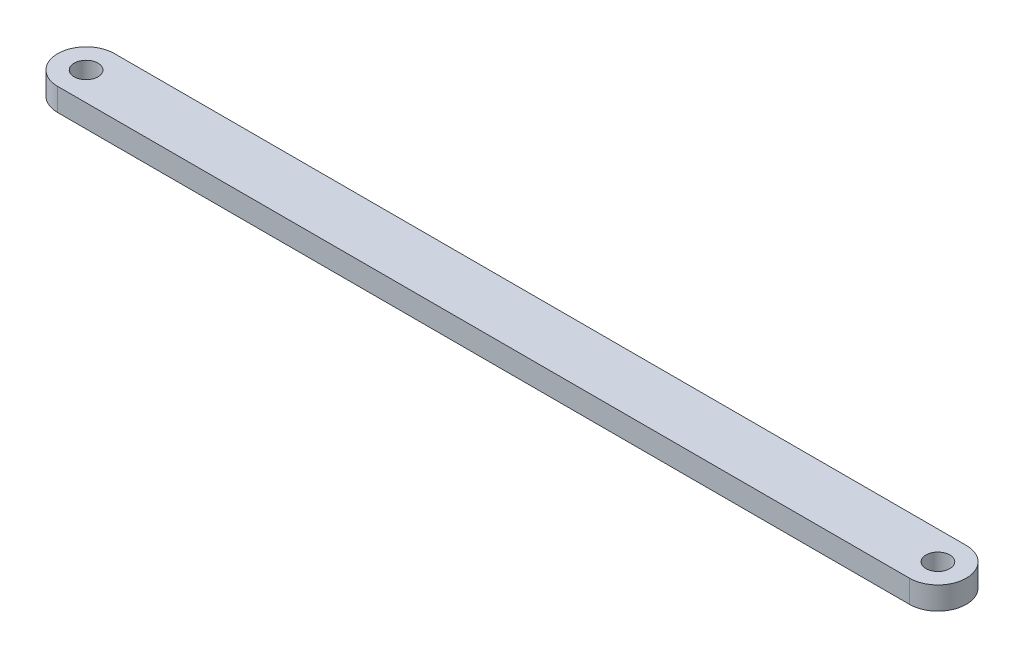
ISO-10303-21;
HEADER;
FILE_DESCRIPTION(('STEP AP214'),'2;1');
FILE_NAME('part.step','',(''),(''),'','','');
FILE_SCHEMA(('AUTOMOTIVE_DESIGN { 1 0 10303 214 1 1 1 1 }'));
ENDSEC;
DATA;
#1=APPLICATION_CONTEXT('core data for automotive mechanical design processes');
#2=APPLICATION_PROTOCOL_DEFINITION('international standard','automotive_design',2000,#1);
#3=PRODUCT_CONTEXT('',#1,'mechanical');
#4=PRODUCT('Part','Part','',(#3));
#5=PRODUCT_RELATED_PRODUCT_CATEGORY('part','',(#4));
#6=PRODUCT_DEFINITION_FORMATION('','',#4);
#7=PRODUCT_DEFINITION_CONTEXT('part definition',#1,'design');
#8=PRODUCT_DEFINITION('design','',#6,#7);
#9=PRODUCT_DEFINITION_SHAPE('','',#8);
#10=(LENGTH_UNIT() NAMED_UNIT(*) SI_UNIT(.MILLI.,.METRE.));
#11=(NAMED_UNIT(*) PLANE_ANGLE_UNIT() SI_UNIT($,.RADIAN.));
#12=(NAMED_UNIT(*) SI_UNIT($,.STERADIAN.) SOLID_ANGLE_UNIT());
#13=UNCERTAINTY_MEASURE_WITH_UNIT(LENGTH_MEASURE(1.E-05),#10,'distance_accuracy_value','');
#14=(GEOMETRIC_REPRESENTATION_CONTEXT(3) GLOBAL_UNCERTAINTY_ASSIGNED_CONTEXT((#13)) GLOBAL_UNIT_ASSIGNED_CONTEXT((#10,
#11,#12)) REPRESENTATION_CONTEXT('',''));
#15=CARTESIAN_POINT('',(0.,0.,0.));
#16=DIRECTION('',(0.,0.,1.));
#17=DIRECTION('',(1.,0.,0.));
#18=AXIS2_PLACEMENT_3D('',#15,#16,#17);
#19=CARTESIAN_POINT('',(0.,2.,0.));
#20=DIRECTION('',(0.,1.,0.));
#21=DIRECTION('',(0.,0.,1.));
#22=AXIS2_PLACEMENT_3D('',#19,#20,#21);
#23=PLANE('',#22);
#24=CARTESIAN_POINT('',(0.,2.,0.));
#25=DIRECTION('',(0.,1.,0.));
#26=DIRECTION('',(0.,0.,1.));
#27=AXIS2_PLACEMENT_3D('',#24,#25,#26);
#28=CIRCLE('',#27,1.05);
#29=CARTESIAN_POINT('',(0.,2.,1.05));
#30=VERTEX_POINT('',#29);
#31=EDGE_CURVE('E116',#30,#30,#28,.T.);
#32=ORIENTED_EDGE('',*,*,#31,.F.);
#33=EDGE_LOOP('',(#32));
#34=FACE_BOUND('',#33,.T.);
#35=CARTESIAN_POINT('',(0.,2.,0.));
#36=DIRECTION('',(0.,1.,0.));
#37=DIRECTION('',(0.,0.,1.));
#38=AXIS2_PLACEMENT_3D('',#35,#36,#37);
#39=CIRCLE('',#38,2.5);
#40=CARTESIAN_POINT('',(0.,2.,-2.5));
#41=VERTEX_POINT('',#40);
#42=CARTESIAN_POINT('',(0.,2.,2.5));
#43=VERTEX_POINT('',#42);
#44=EDGE_CURVE('E96',#41,#43,#39,.T.);
#45=ORIENTED_EDGE('',*,*,#44,.T.);
#46=DIRECTION('',(1.,0.,0.));
#47=VECTOR('',#46,1.);
#48=CARTESIAN_POINT('',(0.,2.,2.5));
#49=LINE('',#48,#47);
#50=CARTESIAN_POINT('',(75.,2.,2.5));
#51=VERTEX_POINT('',#50);
#52=EDGE_CURVE('E91',#43,#51,#49,.T.);
#53=ORIENTED_EDGE('',*,*,#52,.T.);
#54=CARTESIAN_POINT('',(75.,2.,0.));
#55=DIRECTION('',(0.,1.,0.));
#56=DIRECTION('',(0.,0.,1.));
#57=AXIS2_PLACEMENT_3D('',#54,#55,#56);
#58=CIRCLE('',#57,2.5);
#59=CARTESIAN_POINT('',(75.,2.,-2.5));
#60=VERTEX_POINT('',#59);
#61=EDGE_CURVE('E94',#51,#60,#58,.T.);
#62=ORIENTED_EDGE('',*,*,#61,.T.);
#63=DIRECTION('',(-1.,0.,0.));
#64=VECTOR('',#63,1.);
#65=CARTESIAN_POINT('',(0.,2.,-2.5));
#66=LINE('',#65,#64);
#67=EDGE_CURVE('E61',#60,#41,#66,.T.);
#68=ORIENTED_EDGE('',*,*,#67,.T.);
#69=EDGE_LOOP('',(#45,#53,#62,#68));
#70=FACE_BOUND('',#69,.T.);
#71=CARTESIAN_POINT('',(75.,2.,0.));
#72=DIRECTION('',(0.,1.,0.));
#73=DIRECTION('',(0.,0.,1.));
#74=AXIS2_PLACEMENT_3D('',#71,#72,#73);
#75=CIRCLE('',#74,1.04999999999999);
#76=CARTESIAN_POINT('',(75.,2.,1.04999999999999));
#77=VERTEX_POINT('',#76);
#78=EDGE_CURVE('E138',#77,#77,#75,.T.);
#79=ORIENTED_EDGE('',*,*,#78,.F.);
#80=EDGE_LOOP('',(#79));
#81=FACE_BOUND('',#80,.T.);
#82=ADVANCED_FACE('F43',(#34,#70,#81),#23,.T.);
#83=CARTESIAN_POINT('',(0.,0.,0.));
#84=DIRECTION('',(0.,1.,0.));
#85=DIRECTION('',(0.,0.,1.));
#86=AXIS2_PLACEMENT_3D('',#83,#84,#85);
#87=PLANE('',#86);
#88=CARTESIAN_POINT('',(0.,0.,0.));
#89=DIRECTION('',(0.,1.,0.));
#90=DIRECTION('',(0.,0.,1.));
#91=AXIS2_PLACEMENT_3D('',#88,#89,#90);
#92=CIRCLE('',#91,2.5);
#93=CARTESIAN_POINT('',(0.,0.,-2.5));
#94=VERTEX_POINT('',#93);
#95=CARTESIAN_POINT('',(0.,0.,2.5));
#96=VERTEX_POINT('',#95);
#97=EDGE_CURVE('E112',#94,#96,#92,.T.);
#98=ORIENTED_EDGE('',*,*,#97,.F.);
#99=DIRECTION('',(-1.,0.,0.));
#100=VECTOR('',#99,1.);
#101=CARTESIAN_POINT('',(0.,0.,-2.5));
#102=LINE('',#101,#100);
#103=CARTESIAN_POINT('',(75.,0.,-2.5));
#104=VERTEX_POINT('',#103);
#105=EDGE_CURVE('E84',#104,#94,#102,.T.);
#106=ORIENTED_EDGE('',*,*,#105,.F.);
#107=CARTESIAN_POINT('',(75.,0.,0.));
#108=DIRECTION('',(0.,1.,0.));
#109=DIRECTION('',(0.,0.,1.));
#110=AXIS2_PLACEMENT_3D('',#107,#108,#109);
#111=CIRCLE('',#110,2.5);
#112=CARTESIAN_POINT('',(75.,0.,2.5));
#113=VERTEX_POINT('',#112);
#114=EDGE_CURVE('E78',#113,#104,#111,.T.);
#115=ORIENTED_EDGE('',*,*,#114,.F.);
#116=DIRECTION('',(1.,0.,0.));
#117=VECTOR('',#116,1.);
#118=CARTESIAN_POINT('',(0.,0.,2.5));
#119=LINE('',#118,#117);
#120=EDGE_CURVE('E101',#96,#113,#119,.T.);
#121=ORIENTED_EDGE('',*,*,#120,.F.);
#122=EDGE_LOOP('',(#98,#106,#115,#121));
#123=FACE_BOUND('',#122,.T.);
#124=CARTESIAN_POINT('',(0.,0.,0.));
#125=DIRECTION('',(0.,1.,0.));
#126=DIRECTION('',(0.,0.,1.));
#127=AXIS2_PLACEMENT_3D('',#124,#125,#126);
#128=CIRCLE('',#127,1.05);
#129=CARTESIAN_POINT('',(0.,0.,1.05));
#130=VERTEX_POINT('',#129);
#131=EDGE_CURVE('E134',#130,#130,#128,.T.);
#132=ORIENTED_EDGE('',*,*,#131,.T.);
#133=EDGE_LOOP('',(#132));
#134=FACE_BOUND('',#133,.T.);
#135=CARTESIAN_POINT('',(75.,0.,0.));
#136=DIRECTION('',(0.,1.,0.));
#137=DIRECTION('',(0.,0.,1.));
#138=AXIS2_PLACEMENT_3D('',#135,#136,#137);
#139=CIRCLE('',#138,1.04999999999999);
#140=CARTESIAN_POINT('',(75.,0.,1.04999999999999));
#141=VERTEX_POINT('',#140);
#142=EDGE_CURVE('E142',#141,#141,#139,.T.);
#143=ORIENTED_EDGE('',*,*,#142,.T.);
#144=EDGE_LOOP('',(#143));
#145=FACE_BOUND('',#144,.T.);
#146=ADVANCED_FACE('F129',(#123,#134,#145),#87,.F.);
#147=CARTESIAN_POINT('',(0.,2.,0.));
#148=DIRECTION('',(0.,-1.,0.));
#149=DIRECTION('',(0.,0.,-1.));
#150=AXIS2_PLACEMENT_3D('',#147,#148,#149);
#151=CYLINDRICAL_SURFACE('',#150,2.5);
#152=ORIENTED_EDGE('',*,*,#97,.T.);
#153=DIRECTION('',(0.,-1.,0.));
#154=VECTOR('',#153,1.);
#155=CARTESIAN_POINT('',(0.,2.,2.5));
#156=LINE('',#155,#154);
#157=EDGE_CURVE('E11',#43,#96,#156,.T.);
#158=ORIENTED_EDGE('',*,*,#157,.F.);
#159=ORIENTED_EDGE('',*,*,#44,.F.);
#160=DIRECTION('',(0.,-1.,0.));
#161=VECTOR('',#160,1.);
#162=CARTESIAN_POINT('',(0.,2.,-2.5));
#163=LINE('',#162,#161);
#164=EDGE_CURVE('E108',#41,#94,#163,.T.);
#165=ORIENTED_EDGE('',*,*,#164,.T.);
#166=EDGE_LOOP('',(#152,#158,#159,#165));
#167=FACE_BOUND('',#166,.T.);
#168=ADVANCED_FACE('F45',(#167),#151,.T.);
#169=CARTESIAN_POINT('',(0.,2.,2.5));
#170=DIRECTION('',(0.,0.,-1.));
#171=DIRECTION('',(-1.,0.,0.));
#172=AXIS2_PLACEMENT_3D('',#169,#170,#171);
#173=PLANE('',#172);
#174=ORIENTED_EDGE('',*,*,#120,.T.);
#175=DIRECTION('',(0.,-1.,0.));
#176=VECTOR('',#175,1.);
#177=CARTESIAN_POINT('',(75.,2.,2.5));
#178=LINE('',#177,#176);
#179=EDGE_CURVE('E53',#51,#113,#178,.T.);
#180=ORIENTED_EDGE('',*,*,#179,.F.);
#181=ORIENTED_EDGE('',*,*,#52,.F.);
#182=ORIENTED_EDGE('',*,*,#157,.T.);
#183=EDGE_LOOP('',(#174,#180,#181,#182));
#184=FACE_BOUND('',#183,.T.);
#185=ADVANCED_FACE('F100',(#184),#173,.F.);
#186=CARTESIAN_POINT('',(75.,2.,0.));
#187=DIRECTION('',(0.,-1.,0.));
#188=DIRECTION('',(0.,0.,-1.));
#189=AXIS2_PLACEMENT_3D('',#186,#187,#188);
#190=CYLINDRICAL_SURFACE('',#189,2.5);
#191=ORIENTED_EDGE('',*,*,#114,.T.);
#192=DIRECTION('',(0.,-1.,0.));
#193=VECTOR('',#192,1.);
#194=CARTESIAN_POINT('',(75.,2.,-2.5));
#195=LINE('',#194,#193);
#196=EDGE_CURVE('E103',#60,#104,#195,.T.);
#197=ORIENTED_EDGE('',*,*,#196,.F.);
#198=ORIENTED_EDGE('',*,*,#61,.F.);
#199=ORIENTED_EDGE('',*,*,#179,.T.);
#200=EDGE_LOOP('',(#191,#197,#198,#199));
#201=FACE_BOUND('',#200,.T.);
#202=ADVANCED_FACE('F104',(#201),#190,.T.);
#203=CARTESIAN_POINT('',(0.,2.,-2.5));
#204=DIRECTION('',(0.,0.,1.));
#205=DIRECTION('',(1.,0.,0.));
#206=AXIS2_PLACEMENT_3D('',#203,#204,#205);
#207=PLANE('',#206);
#208=ORIENTED_EDGE('',*,*,#105,.T.);
#209=ORIENTED_EDGE('',*,*,#164,.F.);
#210=ORIENTED_EDGE('',*,*,#67,.F.);
#211=ORIENTED_EDGE('',*,*,#196,.T.);
#212=EDGE_LOOP('',(#208,#209,#210,#211));
#213=FACE_BOUND('',#212,.T.);
#214=ADVANCED_FACE('F126',(#213),#207,.F.);
#215=CARTESIAN_POINT('',(0.,2.,0.));
#216=DIRECTION('',(0.,-1.,0.));
#217=DIRECTION('',(0.,0.,-1.));
#218=AXIS2_PLACEMENT_3D('',#215,#216,#217);
#219=CYLINDRICAL_SURFACE('',#218,1.05);
#220=ORIENTED_EDGE('',*,*,#31,.T.);
#221=EDGE_LOOP('',(#220));
#222=FACE_BOUND('',#221,.T.);
#223=ORIENTED_EDGE('',*,*,#131,.F.);
#224=EDGE_LOOP('',(#223));
#225=FACE_BOUND('',#224,.T.);
#226=ADVANCED_FACE('F161',(#222,#225),#219,.F.);
#227=CARTESIAN_POINT('',(75.,2.,0.));
#228=DIRECTION('',(0.,-1.,0.));
#229=DIRECTION('',(0.,0.,-1.));
#230=AXIS2_PLACEMENT_3D('',#227,#228,#229);
#231=CYLINDRICAL_SURFACE('',#230,1.04999999999999);
#232=ORIENTED_EDGE('',*,*,#78,.T.);
#233=EDGE_LOOP('',(#232));
#234=FACE_BOUND('',#233,.T.);
#235=ORIENTED_EDGE('',*,*,#142,.F.);
#236=EDGE_LOOP('',(#235));
#237=FACE_BOUND('',#236,.T.);
#238=ADVANCED_FACE('F150',(#234,#237),#231,.F.);
#239=CLOSED_SHELL('',(#82,#146,#168,#185,#202,#214,#226,#238));
#240=MANIFOLD_SOLID_BREP('B2',#239);
#241=ADVANCED_BREP_SHAPE_REPRESENTATION('',(#18,#240),#14);
#242=SHAPE_DEFINITION_REPRESENTATION(#9,#241);
ENDSEC;
END-ISO-10303-21;
